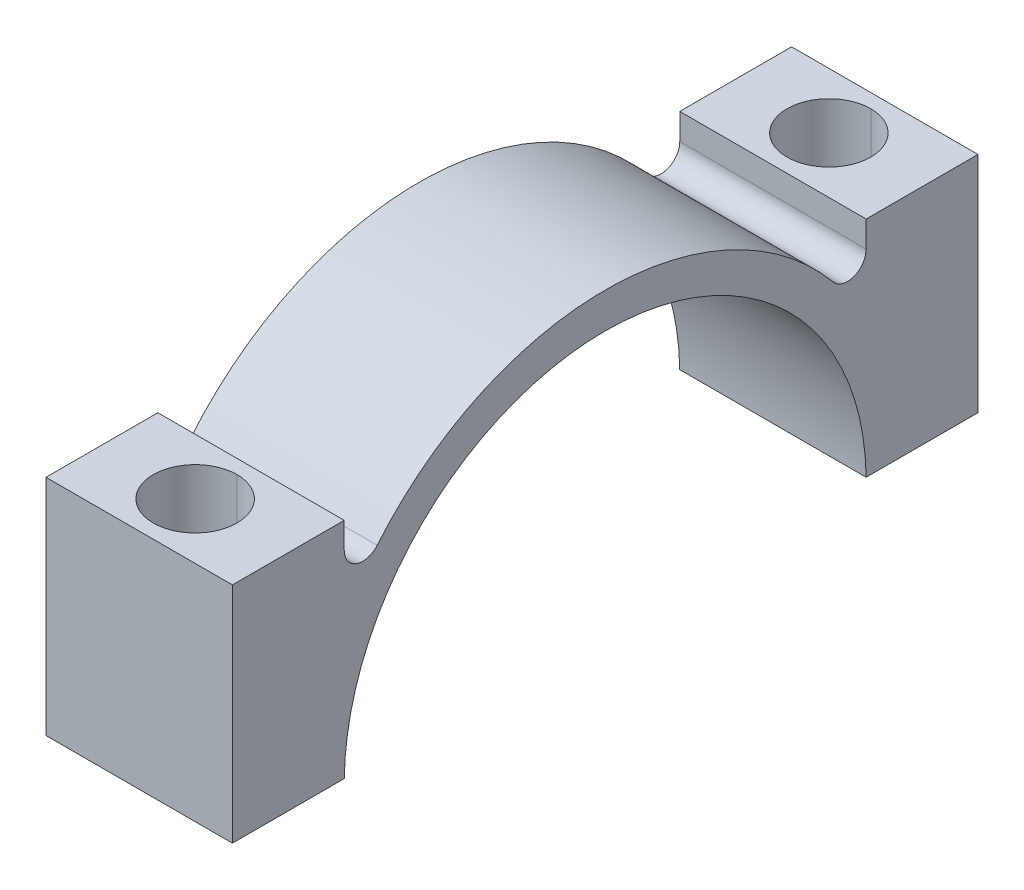
ISO-10303-21;
HEADER;
FILE_DESCRIPTION(('STEP AP214'),'2;1');
FILE_NAME('part.step','',(''),(''),'','','');
FILE_SCHEMA(('AUTOMOTIVE_DESIGN { 1 0 10303 214 1 1 1 1 }'));
ENDSEC;
DATA;
#1=APPLICATION_CONTEXT('core data for automotive mechanical design processes');
#2=APPLICATION_PROTOCOL_DEFINITION('international standard','automotive_design',2000,#1);
#3=PRODUCT_CONTEXT('',#1,'mechanical');
#4=PRODUCT('Part','Part','',(#3));
#5=PRODUCT_RELATED_PRODUCT_CATEGORY('part','',(#4));
#6=PRODUCT_DEFINITION_FORMATION('','',#4);
#7=PRODUCT_DEFINITION_CONTEXT('part definition',#1,'design');
#8=PRODUCT_DEFINITION('design','',#6,#7);
#9=PRODUCT_DEFINITION_SHAPE('','',#8);
#10=(LENGTH_UNIT() NAMED_UNIT(*) SI_UNIT(.MILLI.,.METRE.));
#11=(NAMED_UNIT(*) PLANE_ANGLE_UNIT() SI_UNIT($,.RADIAN.));
#12=(NAMED_UNIT(*) SI_UNIT($,.STERADIAN.) SOLID_ANGLE_UNIT());
#13=UNCERTAINTY_MEASURE_WITH_UNIT(LENGTH_MEASURE(1.E-05),#10,'distance_accuracy_value','');
#14=(GEOMETRIC_REPRESENTATION_CONTEXT(3) GLOBAL_UNCERTAINTY_ASSIGNED_CONTEXT((#13)) GLOBAL_UNIT_ASSIGNED_CONTEXT((#10,
#11,#12)) REPRESENTATION_CONTEXT('',''));
#15=CARTESIAN_POINT('',(0.,0.,0.));
#16=DIRECTION('',(0.,0.,1.));
#17=DIRECTION('',(1.,0.,0.));
#18=AXIS2_PLACEMENT_3D('',#15,#16,#17);
#19=CARTESIAN_POINT('',(0.,12.2,-20.));
#20=DIRECTION('',(0.,-1.,0.));
#21=DIRECTION('',(0.,0.,-1.));
#22=AXIS2_PLACEMENT_3D('',#19,#20,#21);
#23=PLANE('',#22);
#24=CARTESIAN_POINT('',(5.,12.2,-17.));
#25=DIRECTION('',(0.,1.,0.));
#26=DIRECTION('',(0.,0.,-1.));
#27=AXIS2_PLACEMENT_3D('',#24,#25,#26);
#28=CIRCLE('',#27,2.2479);
#29=CARTESIAN_POINT('',(5.,12.2,-19.2479));
#30=VERTEX_POINT('',#29);
#31=CARTESIAN_POINT('',(5.,12.2,-14.7521));
#32=VERTEX_POINT('',#31);
#33=EDGE_CURVE('E327',#30,#32,#28,.T.);
#34=ORIENTED_EDGE('',*,*,#33,.F.);
#35=CARTESIAN_POINT('',(5.,12.2,-17.));
#36=DIRECTION('',(0.,1.,0.));
#37=DIRECTION('',(0.,0.,-1.));
#38=AXIS2_PLACEMENT_3D('',#35,#36,#37);
#39=CIRCLE('',#38,2.2479);
#40=EDGE_CURVE('E11',#32,#30,#39,.T.);
#41=ORIENTED_EDGE('',*,*,#40,.F.);
#42=EDGE_LOOP('',(#34,#41));
#43=FACE_BOUND('',#42,.T.);
#44=DIRECTION('',(0.,0.,-1.));
#45=VECTOR('',#44,1.);
#46=CARTESIAN_POINT('',(10.,12.2,-20.));
#47=LINE('',#46,#45);
#48=CARTESIAN_POINT('',(10.,12.2,-14.));
#49=VERTEX_POINT('',#48);
#50=CARTESIAN_POINT('',(10.,12.2,-20.));
#51=VERTEX_POINT('',#50);
#52=EDGE_CURVE('E231',#49,#51,#47,.T.);
#53=ORIENTED_EDGE('',*,*,#52,.T.);
#54=DIRECTION('',(1.,0.,0.));
#55=VECTOR('',#54,1.);
#56=CARTESIAN_POINT('',(0.,12.2,-20.));
#57=LINE('',#56,#55);
#58=CARTESIAN_POINT('',(0.,12.2,-20.));
#59=VERTEX_POINT('',#58);
#60=EDGE_CURVE('E258',#59,#51,#57,.T.);
#61=ORIENTED_EDGE('',*,*,#60,.F.);
#62=DIRECTION('',(0.,0.,-1.));
#63=VECTOR('',#62,1.);
#64=CARTESIAN_POINT('',(0.,12.2,-20.));
#65=LINE('',#64,#63);
#66=CARTESIAN_POINT('',(0.,12.2,-14.));
#67=VERTEX_POINT('',#66);
#68=EDGE_CURVE('E303',#67,#59,#65,.T.);
#69=ORIENTED_EDGE('',*,*,#68,.F.);
#70=DIRECTION('',(1.,0.,0.));
#71=VECTOR('',#70,1.);
#72=CARTESIAN_POINT('',(0.,12.2,-14.));
#73=LINE('',#72,#71);
#74=EDGE_CURVE('E255',#67,#49,#73,.T.);
#75=ORIENTED_EDGE('',*,*,#74,.T.);
#76=EDGE_LOOP('',(#53,#61,#69,#75));
#77=FACE_BOUND('',#76,.T.);
#78=ADVANCED_FACE('F16',(#43,#77),#23,.F.);
#79=CARTESIAN_POINT('',(0.,12.2,20.));
#80=DIRECTION('',(0.,-1.,0.));
#81=DIRECTION('',(0.,0.,-1.));
#82=AXIS2_PLACEMENT_3D('',#79,#80,#81);
#83=PLANE('',#82);
#84=CARTESIAN_POINT('',(5.,12.2,17.));
#85=DIRECTION('',(0.,1.,0.));
#86=DIRECTION('',(0.,0.,-1.));
#87=AXIS2_PLACEMENT_3D('',#84,#85,#86);
#88=CIRCLE('',#87,2.2479);
#89=CARTESIAN_POINT('',(5.,12.2,14.7521));
#90=VERTEX_POINT('',#89);
#91=CARTESIAN_POINT('',(5.,12.2,19.2479));
#92=VERTEX_POINT('',#91);
#93=EDGE_CURVE('E267',#90,#92,#88,.T.);
#94=ORIENTED_EDGE('',*,*,#93,.F.);
#95=CARTESIAN_POINT('',(5.,12.2,17.));
#96=DIRECTION('',(0.,1.,0.));
#97=DIRECTION('',(0.,0.,-1.));
#98=AXIS2_PLACEMENT_3D('',#95,#96,#97);
#99=CIRCLE('',#98,2.2479);
#100=EDGE_CURVE('E27',#92,#90,#99,.T.);
#101=ORIENTED_EDGE('',*,*,#100,.F.);
#102=EDGE_LOOP('',(#94,#101));
#103=FACE_BOUND('',#102,.T.);
#104=DIRECTION('',(0.,0.,-1.));
#105=VECTOR('',#104,1.);
#106=CARTESIAN_POINT('',(10.,12.2,20.));
#107=LINE('',#106,#105);
#108=CARTESIAN_POINT('',(10.,12.2,20.));
#109=VERTEX_POINT('',#108);
#110=CARTESIAN_POINT('',(10.,12.2,14.));
#111=VERTEX_POINT('',#110);
#112=EDGE_CURVE('E284',#109,#111,#107,.T.);
#113=ORIENTED_EDGE('',*,*,#112,.T.);
#114=DIRECTION('',(1.,0.,0.));
#115=VECTOR('',#114,1.);
#116=CARTESIAN_POINT('',(0.,12.2,14.));
#117=LINE('',#116,#115);
#118=CARTESIAN_POINT('',(0.,12.2,14.));
#119=VERTEX_POINT('',#118);
#120=EDGE_CURVE('E235',#119,#111,#117,.T.);
#121=ORIENTED_EDGE('',*,*,#120,.F.);
#122=DIRECTION('',(0.,0.,-1.));
#123=VECTOR('',#122,1.);
#124=CARTESIAN_POINT('',(0.,12.2,20.));
#125=LINE('',#124,#123);
#126=CARTESIAN_POINT('',(0.,12.2,20.));
#127=VERTEX_POINT('',#126);
#128=EDGE_CURVE('E306',#127,#119,#125,.T.);
#129=ORIENTED_EDGE('',*,*,#128,.F.);
#130=DIRECTION('',(1.,0.,0.));
#131=VECTOR('',#130,1.);
#132=CARTESIAN_POINT('',(0.,12.2,20.));
#133=LINE('',#132,#131);
#134=EDGE_CURVE('E197',#127,#109,#133,.T.);
#135=ORIENTED_EDGE('',*,*,#134,.T.);
#136=EDGE_LOOP('',(#113,#121,#129,#135));
#137=FACE_BOUND('',#136,.T.);
#138=ADVANCED_FACE('F341',(#103,#137),#83,.F.);
#139=CARTESIAN_POINT('',(5.,0.2,-17.));
#140=DIRECTION('',(0.,-1.,0.));
#141=DIRECTION('',(0.,0.,-1.));
#142=AXIS2_PLACEMENT_3D('',#139,#140,#141);
#143=CYLINDRICAL_SURFACE('',#142,2.2479);
#144=DIRECTION('',(0.,-1.,0.));
#145=VECTOR('',#144,1.);
#146=CARTESIAN_POINT('',(5.,0.2,-14.7521));
#147=LINE('',#146,#145);
#148=CARTESIAN_POINT('',(5.,0.2,-14.7521));
#149=VERTEX_POINT('',#148);
#150=EDGE_CURVE('E320',#32,#149,#147,.T.);
#151=ORIENTED_EDGE('',*,*,#150,.F.);
#152=ORIENTED_EDGE('',*,*,#40,.T.);
#153=DIRECTION('',(0.,-1.,0.));
#154=VECTOR('',#153,1.);
#155=CARTESIAN_POINT('',(5.,0.2,-19.2479));
#156=LINE('',#155,#154);
#157=CARTESIAN_POINT('',(5.,0.2,-19.2479));
#158=VERTEX_POINT('',#157);
#159=EDGE_CURVE('E298',#30,#158,#156,.T.);
#160=ORIENTED_EDGE('',*,*,#159,.T.);
#161=CARTESIAN_POINT('',(5.,0.2,-17.));
#162=DIRECTION('',(0.,-1.,0.));
#163=DIRECTION('',(0.,0.,-1.));
#164=AXIS2_PLACEMENT_3D('',#161,#162,#163);
#165=CIRCLE('',#164,2.2479);
#166=EDGE_CURVE('E144',#158,#149,#165,.T.);
#167=ORIENTED_EDGE('',*,*,#166,.T.);
#168=EDGE_LOOP('',(#151,#152,#160,#167));
#169=FACE_BOUND('',#168,.T.);
#170=ADVANCED_FACE('F338',(#169),#143,.F.);
#171=CARTESIAN_POINT('',(5.,0.200000000000004,17.));
#172=DIRECTION('',(0.,-1.,0.));
#173=DIRECTION('',(0.,0.,-1.));
#174=AXIS2_PLACEMENT_3D('',#171,#172,#173);
#175=CYLINDRICAL_SURFACE('',#174,2.2479);
#176=DIRECTION('',(0.,-1.,0.));
#177=VECTOR('',#176,1.);
#178=CARTESIAN_POINT('',(5.,0.200000000000004,19.2479));
#179=LINE('',#178,#177);
#180=CARTESIAN_POINT('',(5.,0.200000000000004,19.2479));
#181=VERTEX_POINT('',#180);
#182=EDGE_CURVE('E263',#92,#181,#179,.T.);
#183=ORIENTED_EDGE('',*,*,#182,.F.);
#184=ORIENTED_EDGE('',*,*,#100,.T.);
#185=DIRECTION('',(0.,-1.,0.));
#186=VECTOR('',#185,1.);
#187=CARTESIAN_POINT('',(5.,0.200000000000004,14.7521));
#188=LINE('',#187,#186);
#189=CARTESIAN_POINT('',(5.,0.200000000000004,14.7521));
#190=VERTEX_POINT('',#189);
#191=EDGE_CURVE('E277',#90,#190,#188,.T.);
#192=ORIENTED_EDGE('',*,*,#191,.T.);
#193=CARTESIAN_POINT('',(5.,0.200000000000004,17.));
#194=DIRECTION('',(0.,-1.,0.));
#195=DIRECTION('',(0.,0.,-1.));
#196=AXIS2_PLACEMENT_3D('',#193,#194,#195);
#197=CIRCLE('',#196,2.2479);
#198=EDGE_CURVE('E271',#190,#181,#197,.T.);
#199=ORIENTED_EDGE('',*,*,#198,.T.);
#200=EDGE_LOOP('',(#183,#184,#192,#199));
#201=FACE_BOUND('',#200,.T.);
#202=ADVANCED_FACE('F340',(#201),#175,.F.);
#203=CARTESIAN_POINT('',(10.,10.7986110217935,-13.));
#204=DIRECTION('',(-1.,0.,0.));
#205=DIRECTION('',(0.,0.,1.));
#206=AXIS2_PLACEMENT_3D('',#203,#204,#205);
#207=CYLINDRICAL_SURFACE('',#206,1.);
#208=CARTESIAN_POINT('',(10.,10.7986110217935,-13.));
#209=DIRECTION('',(-1.,0.,0.));
#210=DIRECTION('',(0.,0.,1.));
#211=AXIS2_PLACEMENT_3D('',#208,#209,#210);
#212=CIRCLE('',#211,1.);
#213=CARTESIAN_POINT('',(10.,10.7986110217935,-14.));
#214=VERTEX_POINT('',#213);
#215=CARTESIAN_POINT('',(10.,10.1596399554152,-12.2307692307692));
#216=VERTEX_POINT('',#215);
#217=EDGE_CURVE('E213',#214,#216,#212,.T.);
#218=ORIENTED_EDGE('',*,*,#217,.F.);
#219=DIRECTION('',(1.,0.,0.));
#220=VECTOR('',#219,1.);
#221=CARTESIAN_POINT('',(10.,10.7986110217935,-14.));
#222=LINE('',#221,#220);
#223=CARTESIAN_POINT('',(0.,10.7986110217935,-14.));
#224=VERTEX_POINT('',#223);
#225=EDGE_CURVE('E42',#224,#214,#222,.T.);
#226=ORIENTED_EDGE('',*,*,#225,.F.);
#227=CARTESIAN_POINT('',(0.,10.7986110217935,-13.));
#228=DIRECTION('',(1.,0.,0.));
#229=DIRECTION('',(0.,0.,1.));
#230=AXIS2_PLACEMENT_3D('',#227,#228,#229);
#231=CIRCLE('',#230,1.);
#232=CARTESIAN_POINT('',(0.,10.1596399554152,-12.2307692307692));
#233=VERTEX_POINT('',#232);
#234=EDGE_CURVE('E20',#233,#224,#231,.T.);
#235=ORIENTED_EDGE('',*,*,#234,.F.);
#236=DIRECTION('',(-1.,0.,0.));
#237=VECTOR('',#236,1.);
#238=CARTESIAN_POINT('',(10.,10.1596399554152,-12.2307692307692));
#239=LINE('',#238,#237);
#240=EDGE_CURVE('E245',#216,#233,#239,.T.);
#241=ORIENTED_EDGE('',*,*,#240,.F.);
#242=EDGE_LOOP('',(#218,#226,#235,#241));
#243=FACE_BOUND('',#242,.T.);
#244=ADVANCED_FACE('F348',(#243),#207,.F.);
#245=CARTESIAN_POINT('',(10.,10.7986110217935,13.));
#246=DIRECTION('',(-1.,0.,0.));
#247=DIRECTION('',(0.,0.,1.));
#248=AXIS2_PLACEMENT_3D('',#245,#246,#247);
#249=CYLINDRICAL_SURFACE('',#248,1.);
#250=CARTESIAN_POINT('',(10.,10.7986110217935,13.));
#251=DIRECTION('',(-1.,0.,0.));
#252=DIRECTION('',(0.,0.,1.));
#253=AXIS2_PLACEMENT_3D('',#250,#251,#252);
#254=CIRCLE('',#253,1.);
#255=CARTESIAN_POINT('',(10.,10.1596399554152,12.2307692307692));
#256=VERTEX_POINT('',#255);
#257=CARTESIAN_POINT('',(10.,10.7986110217935,14.));
#258=VERTEX_POINT('',#257);
#259=EDGE_CURVE('E212',#256,#258,#254,.T.);
#260=ORIENTED_EDGE('',*,*,#259,.F.);
#261=DIRECTION('',(1.,0.,0.));
#262=VECTOR('',#261,1.);
#263=CARTESIAN_POINT('',(10.,10.1596399554152,12.2307692307692));
#264=LINE('',#263,#262);
#265=CARTESIAN_POINT('',(0.,10.1596399554152,12.2307692307692));
#266=VERTEX_POINT('',#265);
#267=EDGE_CURVE('E242',#266,#256,#264,.T.);
#268=ORIENTED_EDGE('',*,*,#267,.F.);
#269=CARTESIAN_POINT('',(0.,10.7986110217935,13.));
#270=DIRECTION('',(1.,0.,0.));
#271=DIRECTION('',(0.,0.,1.));
#272=AXIS2_PLACEMENT_3D('',#269,#270,#271);
#273=CIRCLE('',#272,1.);
#274=CARTESIAN_POINT('',(0.,10.7986110217935,14.));
#275=VERTEX_POINT('',#274);
#276=EDGE_CURVE('E236',#275,#266,#273,.T.);
#277=ORIENTED_EDGE('',*,*,#276,.F.);
#278=DIRECTION('',(-1.,0.,0.));
#279=VECTOR('',#278,1.);
#280=CARTESIAN_POINT('',(0.,10.7986110217935,14.));
#281=LINE('',#280,#279);
#282=EDGE_CURVE('E246',#258,#275,#281,.T.);
#283=ORIENTED_EDGE('',*,*,#282,.F.);
#284=EDGE_LOOP('',(#260,#268,#277,#283));
#285=FACE_BOUND('',#284,.T.);
#286=ADVANCED_FACE('F381',(#285),#249,.F.);
#287=CARTESIAN_POINT('',(10.,16.,-14.));
#288=DIRECTION('',(0.,0.,-1.));
#289=DIRECTION('',(0.,-1.,0.));
#290=AXIS2_PLACEMENT_3D('',#287,#288,#289);
#291=PLANE('',#290);
#292=DIRECTION('',(0.,-1.,0.));
#293=VECTOR('',#292,1.);
#294=CARTESIAN_POINT('',(10.,16.,-14.));
#295=LINE('',#294,#293);
#296=EDGE_CURVE('E227',#49,#214,#295,.T.);
#297=ORIENTED_EDGE('',*,*,#296,.F.);
#298=ORIENTED_EDGE('',*,*,#74,.F.);
#299=DIRECTION('',(0.,-1.,0.));
#300=VECTOR('',#299,1.);
#301=CARTESIAN_POINT('',(0.,16.,-14.));
#302=LINE('',#301,#300);
#303=EDGE_CURVE('E232',#67,#224,#302,.T.);
#304=ORIENTED_EDGE('',*,*,#303,.T.);
#305=ORIENTED_EDGE('',*,*,#225,.T.);
#306=EDGE_LOOP('',(#297,#298,#304,#305));
#307=FACE_BOUND('',#306,.T.);
#308=ADVANCED_FACE('F377',(#307),#291,.F.);
#309=CARTESIAN_POINT('',(10.,0.,0.));
#310=DIRECTION('',(-1.,0.,0.));
#311=DIRECTION('',(0.,0.,1.));
#312=AXIS2_PLACEMENT_3D('',#309,#310,#311);
#313=CYLINDRICAL_SURFACE('',#312,15.9);
#314=CARTESIAN_POINT('',(0.,0.,0.));
#315=DIRECTION('',(1.,0.,0.));
#316=DIRECTION('',(0.,0.,-1.));
#317=AXIS2_PLACEMENT_3D('',#314,#315,#316);
#318=CIRCLE('',#317,15.9);
#319=EDGE_CURVE('E240',#233,#266,#318,.T.);
#320=ORIENTED_EDGE('',*,*,#319,.T.);
#321=ORIENTED_EDGE('',*,*,#267,.T.);
#322=CARTESIAN_POINT('',(10.,0.,0.));
#323=DIRECTION('',(1.,0.,0.));
#324=DIRECTION('',(0.,0.,-1.));
#325=AXIS2_PLACEMENT_3D('',#322,#323,#324);
#326=CIRCLE('',#325,15.9);
#327=EDGE_CURVE('E208',#216,#256,#326,.T.);
#328=ORIENTED_EDGE('',*,*,#327,.F.);
#329=ORIENTED_EDGE('',*,*,#240,.T.);
#330=EDGE_LOOP('',(#320,#321,#328,#329));
#331=FACE_BOUND('',#330,.T.);
#332=ADVANCED_FACE('F380',(#331),#313,.T.);
#333=CARTESIAN_POINT('',(10.,16.,14.));
#334=DIRECTION('',(0.,0.,1.));
#335=DIRECTION('',(1.,0.,0.));
#336=AXIS2_PLACEMENT_3D('',#333,#334,#335);
#337=PLANE('',#336);
#338=DIRECTION('',(0.,1.,0.));
#339=VECTOR('',#338,1.);
#340=CARTESIAN_POINT('',(0.,16.,14.));
#341=LINE('',#340,#339);
#342=EDGE_CURVE('E241',#275,#119,#341,.T.);
#343=ORIENTED_EDGE('',*,*,#342,.T.);
#344=ORIENTED_EDGE('',*,*,#120,.T.);
#345=DIRECTION('',(0.,1.,0.));
#346=VECTOR('',#345,1.);
#347=CARTESIAN_POINT('',(10.,16.,14.));
#348=LINE('',#347,#346);
#349=EDGE_CURVE('E281',#258,#111,#348,.T.);
#350=ORIENTED_EDGE('',*,*,#349,.F.);
#351=ORIENTED_EDGE('',*,*,#282,.T.);
#352=EDGE_LOOP('',(#343,#344,#350,#351));
#353=FACE_BOUND('',#352,.T.);
#354=ADVANCED_FACE('F387',(#353),#337,.F.);
#355=CARTESIAN_POINT('',(0.,0.,0.));
#356=DIRECTION('',(-1.,0.,0.));
#357=DIRECTION('',(0.,0.,1.));
#358=AXIS2_PLACEMENT_3D('',#355,#356,#357);
#359=PLANE('',#358);
#360=ORIENTED_EDGE('',*,*,#68,.T.);
#361=DIRECTION('',(0.,1.,0.));
#362=VECTOR('',#361,1.);
#363=CARTESIAN_POINT('',(0.,16.,-20.));
#364=LINE('',#363,#362);
#365=CARTESIAN_POINT('',(0.,0.2,-20.));
#366=VERTEX_POINT('',#365);
#367=EDGE_CURVE('E251',#366,#59,#364,.T.);
#368=ORIENTED_EDGE('',*,*,#367,.F.);
#369=DIRECTION('',(0.,0.,-1.));
#370=VECTOR('',#369,1.);
#371=CARTESIAN_POINT('',(0.,0.2,-20.));
#372=LINE('',#371,#370);
#373=CARTESIAN_POINT('',(0.,0.2,-13.9985713556777));
#374=VERTEX_POINT('',#373);
#375=EDGE_CURVE('E214',#374,#366,#372,.T.);
#376=ORIENTED_EDGE('',*,*,#375,.F.);
#377=CARTESIAN_POINT('',(0.,0.,0.));
#378=DIRECTION('',(-1.,0.,0.));
#379=DIRECTION('',(0.,0.,1.));
#380=AXIS2_PLACEMENT_3D('',#377,#378,#379);
#381=CIRCLE('',#380,14.);
#382=CARTESIAN_POINT('',(0.,0.2,13.9985713556777));
#383=VERTEX_POINT('',#382);
#384=EDGE_CURVE('E181',#383,#374,#381,.T.);
#385=ORIENTED_EDGE('',*,*,#384,.F.);
#386=DIRECTION('',(0.,0.,-1.));
#387=VECTOR('',#386,1.);
#388=CARTESIAN_POINT('',(0.,0.2,13.9985713556777));
#389=LINE('',#388,#387);
#390=CARTESIAN_POINT('',(0.,0.2,20.));
#391=VERTEX_POINT('',#390);
#392=EDGE_CURVE('E173',#391,#383,#389,.T.);
#393=ORIENTED_EDGE('',*,*,#392,.F.);
#394=DIRECTION('',(0.,-1.,0.));
#395=VECTOR('',#394,1.);
#396=CARTESIAN_POINT('',(0.,0.2,20.));
#397=LINE('',#396,#395);
#398=EDGE_CURVE('E178',#127,#391,#397,.T.);
#399=ORIENTED_EDGE('',*,*,#398,.F.);
#400=ORIENTED_EDGE('',*,*,#128,.T.);
#401=ORIENTED_EDGE('',*,*,#342,.F.);
#402=ORIENTED_EDGE('',*,*,#276,.T.);
#403=ORIENTED_EDGE('',*,*,#319,.F.);
#404=ORIENTED_EDGE('',*,*,#234,.T.);
#405=ORIENTED_EDGE('',*,*,#303,.F.);
#406=EDGE_LOOP('',(#360,#368,#376,#385,#393,#399,#400,#401,#402,#403,#404,#405));
#407=FACE_BOUND('',#406,.T.);
#408=ADVANCED_FACE('F175',(#407),#359,.T.);
#409=CARTESIAN_POINT('',(10.,0.,0.));
#410=DIRECTION('',(-1.,0.,0.));
#411=DIRECTION('',(0.,0.,1.));
#412=AXIS2_PLACEMENT_3D('',#409,#410,#411);
#413=PLANE('',#412);
#414=DIRECTION('',(0.,1.,0.));
#415=VECTOR('',#414,1.);
#416=CARTESIAN_POINT('',(10.,16.,-20.));
#417=LINE('',#416,#415);
#418=CARTESIAN_POINT('',(10.,0.2,-20.));
#419=VERTEX_POINT('',#418);
#420=EDGE_CURVE('E262',#419,#51,#417,.T.);
#421=ORIENTED_EDGE('',*,*,#420,.T.);
#422=ORIENTED_EDGE('',*,*,#52,.F.);
#423=ORIENTED_EDGE('',*,*,#296,.T.);
#424=ORIENTED_EDGE('',*,*,#217,.T.);
#425=ORIENTED_EDGE('',*,*,#327,.T.);
#426=ORIENTED_EDGE('',*,*,#259,.T.);
#427=ORIENTED_EDGE('',*,*,#349,.T.);
#428=ORIENTED_EDGE('',*,*,#112,.F.);
#429=DIRECTION('',(0.,-1.,0.));
#430=VECTOR('',#429,1.);
#431=CARTESIAN_POINT('',(10.,0.2,20.));
#432=LINE('',#431,#430);
#433=CARTESIAN_POINT('',(10.,0.2,20.));
#434=VERTEX_POINT('',#433);
#435=EDGE_CURVE('E204',#109,#434,#432,.T.);
#436=ORIENTED_EDGE('',*,*,#435,.T.);
#437=DIRECTION('',(0.,0.,-1.));
#438=VECTOR('',#437,1.);
#439=CARTESIAN_POINT('',(10.,0.2,13.9985713556777));
#440=LINE('',#439,#438);
#441=CARTESIAN_POINT('',(10.,0.2,13.9985713556777));
#442=VERTEX_POINT('',#441);
#443=EDGE_CURVE('E186',#434,#442,#440,.T.);
#444=ORIENTED_EDGE('',*,*,#443,.T.);
#445=CARTESIAN_POINT('',(10.,0.,0.));
#446=DIRECTION('',(-1.,0.,0.));
#447=DIRECTION('',(0.,0.,1.));
#448=AXIS2_PLACEMENT_3D('',#445,#446,#447);
#449=CIRCLE('',#448,14.);
#450=CARTESIAN_POINT('',(10.,0.2,-13.9985713556777));
#451=VERTEX_POINT('',#450);
#452=EDGE_CURVE('E222',#442,#451,#449,.T.);
#453=ORIENTED_EDGE('',*,*,#452,.T.);
#454=DIRECTION('',(0.,0.,-1.));
#455=VECTOR('',#454,1.);
#456=CARTESIAN_POINT('',(10.,0.2,-20.));
#457=LINE('',#456,#455);
#458=EDGE_CURVE('E252',#451,#419,#457,.T.);
#459=ORIENTED_EDGE('',*,*,#458,.T.);
#460=EDGE_LOOP('',(#421,#422,#423,#424,#425,#426,#427,#428,#436,#444,#453,#459));
#461=FACE_BOUND('',#460,.T.);
#462=ADVANCED_FACE('F376',(#461),#413,.F.);
#463=CARTESIAN_POINT('',(10.,0.2,13.9985713556777));
#464=DIRECTION('',(0.,1.,0.));
#465=DIRECTION('',(0.,0.,-1.));
#466=AXIS2_PLACEMENT_3D('',#463,#464,#465);
#467=PLANE('',#466);
#468=ORIENTED_EDGE('',*,*,#198,.F.);
#469=CARTESIAN_POINT('',(5.,0.200000000000004,17.));
#470=DIRECTION('',(0.,-1.,0.));
#471=DIRECTION('',(0.,0.,-1.));
#472=AXIS2_PLACEMENT_3D('',#469,#470,#471);
#473=CIRCLE('',#472,2.2479);
#474=EDGE_CURVE('E266',#181,#190,#473,.T.);
#475=ORIENTED_EDGE('',*,*,#474,.F.);
#476=EDGE_LOOP('',(#468,#475));
#477=FACE_BOUND('',#476,.T.);
#478=ORIENTED_EDGE('',*,*,#392,.T.);
#479=DIRECTION('',(-1.,0.,0.));
#480=VECTOR('',#479,1.);
#481=CARTESIAN_POINT('',(10.,0.2,13.9985713556777));
#482=LINE('',#481,#480);
#483=EDGE_CURVE('E219',#442,#383,#482,.T.);
#484=ORIENTED_EDGE('',*,*,#483,.F.);
#485=ORIENTED_EDGE('',*,*,#443,.F.);
#486=DIRECTION('',(-1.,0.,0.));
#487=VECTOR('',#486,1.);
#488=CARTESIAN_POINT('',(10.,0.2,20.));
#489=LINE('',#488,#487);
#490=EDGE_CURVE('E187',#434,#391,#489,.T.);
#491=ORIENTED_EDGE('',*,*,#490,.T.);
#492=EDGE_LOOP('',(#478,#484,#485,#491));
#493=FACE_BOUND('',#492,.T.);
#494=ADVANCED_FACE('F190',(#477,#493),#467,.F.);
#495=CARTESIAN_POINT('',(10.,0.2,20.));
#496=DIRECTION('',(0.,0.,-1.));
#497=DIRECTION('',(-1.,0.,0.));
#498=AXIS2_PLACEMENT_3D('',#495,#496,#497);
#499=PLANE('',#498);
#500=ORIENTED_EDGE('',*,*,#435,.F.);
#501=ORIENTED_EDGE('',*,*,#134,.F.);
#502=ORIENTED_EDGE('',*,*,#398,.T.);
#503=ORIENTED_EDGE('',*,*,#490,.F.);
#504=EDGE_LOOP('',(#500,#501,#502,#503));
#505=FACE_BOUND('',#504,.T.);
#506=ADVANCED_FACE('F18',(#505),#499,.F.);
#507=CARTESIAN_POINT('',(10.,16.,-20.));
#508=DIRECTION('',(0.,0.,1.));
#509=DIRECTION('',(0.,-1.,0.));
#510=AXIS2_PLACEMENT_3D('',#507,#508,#509);
#511=PLANE('',#510);
#512=ORIENTED_EDGE('',*,*,#367,.T.);
#513=ORIENTED_EDGE('',*,*,#60,.T.);
#514=ORIENTED_EDGE('',*,*,#420,.F.);
#515=DIRECTION('',(-1.,0.,0.));
#516=VECTOR('',#515,1.);
#517=CARTESIAN_POINT('',(10.,0.2,-20.));
#518=LINE('',#517,#516);
#519=EDGE_CURVE('E218',#419,#366,#518,.T.);
#520=ORIENTED_EDGE('',*,*,#519,.T.);
#521=EDGE_LOOP('',(#512,#513,#514,#520));
#522=FACE_BOUND('',#521,.T.);
#523=ADVANCED_FACE('F390',(#522),#511,.F.);
#524=CARTESIAN_POINT('',(10.,0.2,-20.));
#525=DIRECTION('',(0.,1.,0.));
#526=DIRECTION('',(0.,0.,-1.));
#527=AXIS2_PLACEMENT_3D('',#524,#525,#526);
#528=PLANE('',#527);
#529=ORIENTED_EDGE('',*,*,#166,.F.);
#530=CARTESIAN_POINT('',(5.,0.2,-17.));
#531=DIRECTION('',(0.,-1.,0.));
#532=DIRECTION('',(0.,0.,-1.));
#533=AXIS2_PLACEMENT_3D('',#530,#531,#532);
#534=CIRCLE('',#533,2.2479);
#535=EDGE_CURVE('E316',#149,#158,#534,.T.);
#536=ORIENTED_EDGE('',*,*,#535,.F.);
#537=EDGE_LOOP('',(#529,#536));
#538=FACE_BOUND('',#537,.T.);
#539=ORIENTED_EDGE('',*,*,#375,.T.);
#540=ORIENTED_EDGE('',*,*,#519,.F.);
#541=ORIENTED_EDGE('',*,*,#458,.F.);
#542=DIRECTION('',(-1.,0.,0.));
#543=VECTOR('',#542,1.);
#544=CARTESIAN_POINT('',(10.,0.2,-13.9985713556777));
#545=LINE('',#544,#543);
#546=EDGE_CURVE('E226',#451,#374,#545,.T.);
#547=ORIENTED_EDGE('',*,*,#546,.T.);
#548=EDGE_LOOP('',(#539,#540,#541,#547));
#549=FACE_BOUND('',#548,.T.);
#550=ADVANCED_FACE('F371',(#538,#549),#528,.F.);
#551=CARTESIAN_POINT('',(10.,0.,0.));
#552=DIRECTION('',(-1.,0.,0.));
#553=DIRECTION('',(0.,0.,1.));
#554=AXIS2_PLACEMENT_3D('',#551,#552,#553);
#555=CYLINDRICAL_SURFACE('',#554,14.);
#556=ORIENTED_EDGE('',*,*,#384,.T.);
#557=ORIENTED_EDGE('',*,*,#546,.F.);
#558=ORIENTED_EDGE('',*,*,#452,.F.);
#559=ORIENTED_EDGE('',*,*,#483,.T.);
#560=EDGE_LOOP('',(#556,#557,#558,#559));
#561=FACE_BOUND('',#560,.T.);
#562=ADVANCED_FACE('F365',(#561),#555,.F.);
#563=CARTESIAN_POINT('',(5.,0.200000000000004,17.));
#564=DIRECTION('',(0.,-1.,0.));
#565=DIRECTION('',(0.,0.,-1.));
#566=AXIS2_PLACEMENT_3D('',#563,#564,#565);
#567=CYLINDRICAL_SURFACE('',#566,2.2479);
#568=ORIENTED_EDGE('',*,*,#93,.T.);
#569=ORIENTED_EDGE('',*,*,#182,.T.);
#570=ORIENTED_EDGE('',*,*,#474,.T.);
#571=ORIENTED_EDGE('',*,*,#191,.F.);
#572=EDGE_LOOP('',(#568,#569,#570,#571));
#573=FACE_BOUND('',#572,.T.);
#574=ADVANCED_FACE('F361',(#573),#567,.F.);
#575=CARTESIAN_POINT('',(5.,0.2,-17.));
#576=DIRECTION('',(0.,-1.,0.));
#577=DIRECTION('',(0.,0.,-1.));
#578=AXIS2_PLACEMENT_3D('',#575,#576,#577);
#579=CYLINDRICAL_SURFACE('',#578,2.2479);
#580=ORIENTED_EDGE('',*,*,#33,.T.);
#581=ORIENTED_EDGE('',*,*,#150,.T.);
#582=ORIENTED_EDGE('',*,*,#535,.T.);
#583=ORIENTED_EDGE('',*,*,#159,.F.);
#584=EDGE_LOOP('',(#580,#581,#582,#583));
#585=FACE_BOUND('',#584,.T.);
#586=ADVANCED_FACE('F335',(#585),#579,.F.);
#587=CLOSED_SHELL('',(#78,#138,#170,#202,#244,#286,#308,#332,#354,#408,#462,#494,#506,#523,#550,
#562,#574,#586));
#588=MANIFOLD_SOLID_BREP('B1',#587);
#589=ADVANCED_BREP_SHAPE_REPRESENTATION('',(#18,#588),#14);
#590=SHAPE_DEFINITION_REPRESENTATION(#9,#589);
ENDSEC;
END-ISO-10303-21;
